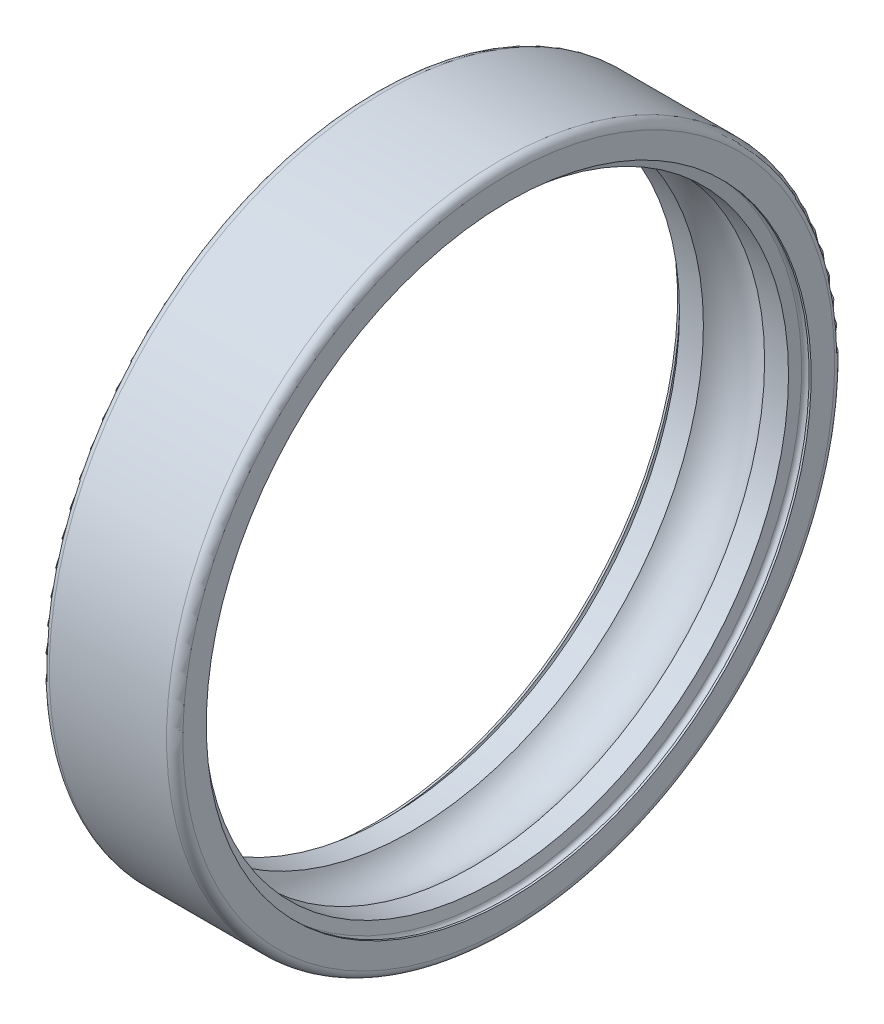
ISO-10303-21;
HEADER;
FILE_DESCRIPTION(('STEP AP214'),'2;1');
FILE_NAME('part.step','',(''),(''),'','','');
FILE_SCHEMA(('AUTOMOTIVE_DESIGN { 1 0 10303 214 1 1 1 1 }'));
ENDSEC;
DATA;
#1=APPLICATION_CONTEXT('core data for automotive mechanical design processes');
#2=APPLICATION_PROTOCOL_DEFINITION('international standard','automotive_design',2000,#1);
#3=PRODUCT_CONTEXT('',#1,'mechanical');
#4=PRODUCT('Part','Part','',(#3));
#5=PRODUCT_RELATED_PRODUCT_CATEGORY('part','',(#4));
#6=PRODUCT_DEFINITION_FORMATION('','',#4);
#7=PRODUCT_DEFINITION_CONTEXT('part definition',#1,'design');
#8=PRODUCT_DEFINITION('design','',#6,#7);
#9=PRODUCT_DEFINITION_SHAPE('','',#8);
#10=(LENGTH_UNIT() NAMED_UNIT(*) SI_UNIT(.MILLI.,.METRE.));
#11=(NAMED_UNIT(*) PLANE_ANGLE_UNIT() SI_UNIT($,.RADIAN.));
#12=(NAMED_UNIT(*) SI_UNIT($,.STERADIAN.) SOLID_ANGLE_UNIT());
#13=UNCERTAINTY_MEASURE_WITH_UNIT(LENGTH_MEASURE(1.E-05),#10,'distance_accuracy_value','');
#14=(GEOMETRIC_REPRESENTATION_CONTEXT(3) GLOBAL_UNCERTAINTY_ASSIGNED_CONTEXT((#13)) GLOBAL_UNIT_ASSIGNED_CONTEXT((#10,
#11,#12)) REPRESENTATION_CONTEXT('',''));
#15=CARTESIAN_POINT('',(0.,0.,0.));
#16=DIRECTION('',(0.,0.,1.));
#17=DIRECTION('',(1.,0.,0.));
#18=AXIS2_PLACEMENT_3D('',#15,#16,#17);
#19=CARTESIAN_POINT('',(17.16,0.,0.));
#20=DIRECTION('',(1.,0.,0.));
#21=DIRECTION('',(0.,0.,-1.));
#22=AXIS2_PLACEMENT_3D('',#19,#20,#21);
#23=TOROIDAL_SURFACE('',#22,40.75,0.56);
#24=CARTESIAN_POINT('',(17.72,0.,0.));
#25=DIRECTION('',(1.,0.,0.));
#26=DIRECTION('',(0.,1.,0.));
#27=AXIS2_PLACEMENT_3D('',#24,#25,#26);
#28=CIRCLE('',#27,40.75);
#29=CARTESIAN_POINT('',(17.72,40.75,0.));
#30=VERTEX_POINT('',#29);
#31=EDGE_CURVE('E11',#30,#30,#28,.T.);
#32=ORIENTED_EDGE('',*,*,#31,.T.);
#33=EDGE_LOOP('',(#32));
#34=FACE_BOUND('',#33,.T.);
#35=CARTESIAN_POINT('',(16.6085076583131,0.,0.));
#36=DIRECTION('',(1.,0.,0.));
#37=DIRECTION('',(0.,1.,0.));
#38=AXIS2_PLACEMENT_3D('',#35,#36,#37);
#39=CIRCLE('',#38,40.8472429794935);
#40=CARTESIAN_POINT('',(16.6085076583131,40.8472429794935,0.));
#41=VERTEX_POINT('',#40);
#42=EDGE_CURVE('E102',#41,#41,#39,.T.);
#43=ORIENTED_EDGE('',*,*,#42,.F.);
#44=EDGE_LOOP('',(#43));
#45=FACE_BOUND('',#44,.T.);
#46=ADVANCED_FACE('F16',(#34,#45),#23,.F.);
#47=CARTESIAN_POINT('',(17.86,0.,0.));
#48=DIRECTION('',(-1.,0.,0.));
#49=DIRECTION('',(0.,1.,0.));
#50=AXIS2_PLACEMENT_3D('',#47,#48,#49);
#51=CYLINDRICAL_SURFACE('',#50,40.75);
#52=CARTESIAN_POINT('',(18.,0.,0.));
#53=DIRECTION('',(1.,0.,0.));
#54=DIRECTION('',(0.,1.,0.));
#55=AXIS2_PLACEMENT_3D('',#52,#53,#54);
#56=CIRCLE('',#55,40.75);
#57=CARTESIAN_POINT('',(18.,40.75,0.));
#58=VERTEX_POINT('',#57);
#59=EDGE_CURVE('E25',#58,#58,#56,.T.);
#60=ORIENTED_EDGE('',*,*,#59,.T.);
#61=EDGE_LOOP('',(#60));
#62=FACE_BOUND('',#61,.T.);
#63=ORIENTED_EDGE('',*,*,#31,.F.);
#64=EDGE_LOOP('',(#63));
#65=FACE_BOUND('',#64,.T.);
#66=ADVANCED_FACE('F119',(#62,#65),#51,.F.);
#67=CARTESIAN_POINT('',(18.,42.325,0.));
#68=DIRECTION('',(1.,0.,0.));
#69=DIRECTION('',(0.,1.,0.));
#70=AXIS2_PLACEMENT_3D('',#67,#68,#69);
#71=PLANE('',#70);
#72=CARTESIAN_POINT('',(18.,0.,0.));
#73=DIRECTION('',(1.,0.,0.));
#74=DIRECTION('',(0.,1.,0.));
#75=AXIS2_PLACEMENT_3D('',#72,#73,#74);
#76=CIRCLE('',#75,43.9);
#77=CARTESIAN_POINT('',(18.,43.9,0.));
#78=VERTEX_POINT('',#77);
#79=EDGE_CURVE('E73',#78,#78,#76,.T.);
#80=ORIENTED_EDGE('',*,*,#79,.T.);
#81=EDGE_LOOP('',(#80));
#82=FACE_BOUND('',#81,.T.);
#83=ORIENTED_EDGE('',*,*,#59,.F.);
#84=EDGE_LOOP('',(#83));
#85=FACE_BOUND('',#84,.T.);
#86=ADVANCED_FACE('F124',(#82,#85),#71,.T.);
#87=CARTESIAN_POINT('',(16.9,0.,0.));
#88=DIRECTION('',(1.,0.,0.));
#89=DIRECTION('',(0.,0.,-1.));
#90=AXIS2_PLACEMENT_3D('',#87,#88,#89);
#91=TOROIDAL_SURFACE('',#90,43.9,1.1);
#92=CARTESIAN_POINT('',(16.9,0.,0.));
#93=DIRECTION('',(1.,0.,0.));
#94=DIRECTION('',(0.,1.,0.));
#95=AXIS2_PLACEMENT_3D('',#92,#93,#94);
#96=CIRCLE('',#95,45.);
#97=CARTESIAN_POINT('',(16.9,45.,0.));
#98=VERTEX_POINT('',#97);
#99=EDGE_CURVE('E20',#98,#98,#96,.T.);
#100=ORIENTED_EDGE('',*,*,#99,.T.);
#101=EDGE_LOOP('',(#100));
#102=FACE_BOUND('',#101,.T.);
#103=ORIENTED_EDGE('',*,*,#79,.F.);
#104=EDGE_LOOP('',(#103));
#105=FACE_BOUND('',#104,.T.);
#106=ADVANCED_FACE('F70',(#102,#105),#91,.T.);
#107=CARTESIAN_POINT('',(9.,0.,0.));
#108=DIRECTION('',(-1.,0.,0.));
#109=DIRECTION('',(0.,1.,0.));
#110=AXIS2_PLACEMENT_3D('',#107,#108,#109);
#111=CYLINDRICAL_SURFACE('',#110,45.);
#112=CARTESIAN_POINT('',(1.1,0.,0.));
#113=DIRECTION('',(1.,0.,0.));
#114=DIRECTION('',(0.,1.,0.));
#115=AXIS2_PLACEMENT_3D('',#112,#113,#114);
#116=CIRCLE('',#115,45.);
#117=CARTESIAN_POINT('',(1.1,45.,0.));
#118=VERTEX_POINT('',#117);
#119=EDGE_CURVE('E74',#118,#118,#116,.T.);
#120=ORIENTED_EDGE('',*,*,#119,.T.);
#121=EDGE_LOOP('',(#120));
#122=FACE_BOUND('',#121,.T.);
#123=ORIENTED_EDGE('',*,*,#99,.F.);
#124=EDGE_LOOP('',(#123));
#125=FACE_BOUND('',#124,.T.);
#126=ADVANCED_FACE('F146',(#122,#125),#111,.T.);
#127=CARTESIAN_POINT('',(1.1,0.,0.));
#128=DIRECTION('',(1.,0.,0.));
#129=DIRECTION('',(0.,0.,-1.));
#130=AXIS2_PLACEMENT_3D('',#127,#128,#129);
#131=TOROIDAL_SURFACE('',#130,43.9,1.1);
#132=CARTESIAN_POINT('',(0.,0.,0.));
#133=DIRECTION('',(1.,0.,0.));
#134=DIRECTION('',(0.,1.,0.));
#135=AXIS2_PLACEMENT_3D('',#132,#133,#134);
#136=CIRCLE('',#135,43.9);
#137=CARTESIAN_POINT('',(0.,43.9,0.));
#138=VERTEX_POINT('',#137);
#139=EDGE_CURVE('E76',#138,#138,#136,.T.);
#140=ORIENTED_EDGE('',*,*,#139,.T.);
#141=EDGE_LOOP('',(#140));
#142=FACE_BOUND('',#141,.T.);
#143=ORIENTED_EDGE('',*,*,#119,.F.);
#144=EDGE_LOOP('',(#143));
#145=FACE_BOUND('',#144,.T.);
#146=ADVANCED_FACE('F144',(#142,#145),#131,.T.);
#147=CARTESIAN_POINT('',(0.,42.325,0.));
#148=DIRECTION('',(-1.,0.,0.));
#149=DIRECTION('',(0.,-1.,0.));
#150=AXIS2_PLACEMENT_3D('',#147,#148,#149);
#151=PLANE('',#150);
#152=CARTESIAN_POINT('',(0.,0.,0.));
#153=DIRECTION('',(1.,0.,0.));
#154=DIRECTION('',(0.,1.,0.));
#155=AXIS2_PLACEMENT_3D('',#152,#153,#154);
#156=CIRCLE('',#155,40.75);
#157=CARTESIAN_POINT('',(0.,40.75,0.));
#158=VERTEX_POINT('',#157);
#159=EDGE_CURVE('E80',#158,#158,#156,.T.);
#160=ORIENTED_EDGE('',*,*,#159,.T.);
#161=EDGE_LOOP('',(#160));
#162=FACE_BOUND('',#161,.T.);
#163=ORIENTED_EDGE('',*,*,#139,.F.);
#164=EDGE_LOOP('',(#163));
#165=FACE_BOUND('',#164,.T.);
#166=ADVANCED_FACE('F134',(#162,#165),#151,.T.);
#167=CARTESIAN_POINT('',(0.14,0.,0.));
#168=DIRECTION('',(-1.,0.,0.));
#169=DIRECTION('',(0.,1.,0.));
#170=AXIS2_PLACEMENT_3D('',#167,#168,#169);
#171=CYLINDRICAL_SURFACE('',#170,40.75);
#172=CARTESIAN_POINT('',(0.28,0.,0.));
#173=DIRECTION('',(1.,0.,0.));
#174=DIRECTION('',(0.,1.,0.));
#175=AXIS2_PLACEMENT_3D('',#172,#173,#174);
#176=CIRCLE('',#175,40.75);
#177=CARTESIAN_POINT('',(0.28,40.75,0.));
#178=VERTEX_POINT('',#177);
#179=EDGE_CURVE('E85',#178,#178,#176,.T.);
#180=ORIENTED_EDGE('',*,*,#179,.T.);
#181=EDGE_LOOP('',(#180));
#182=FACE_BOUND('',#181,.T.);
#183=ORIENTED_EDGE('',*,*,#159,.F.);
#184=EDGE_LOOP('',(#183));
#185=FACE_BOUND('',#184,.T.);
#186=ADVANCED_FACE('F130',(#182,#185),#171,.F.);
#187=CARTESIAN_POINT('',(0.84,0.,0.));
#188=DIRECTION('',(1.,0.,0.));
#189=DIRECTION('',(0.,0.,-1.));
#190=AXIS2_PLACEMENT_3D('',#187,#188,#189);
#191=TOROIDAL_SURFACE('',#190,40.75,0.56);
#192=CARTESIAN_POINT('',(1.39149234168683,0.,0.));
#193=DIRECTION('',(1.,0.,0.));
#194=DIRECTION('',(0.,1.,0.));
#195=AXIS2_PLACEMENT_3D('',#192,#193,#194);
#196=CIRCLE('',#195,40.8472429794935);
#197=CARTESIAN_POINT('',(1.39149234168683,40.8472429794935,0.));
#198=VERTEX_POINT('',#197);
#199=EDGE_CURVE('E83',#198,#198,#196,.T.);
#200=ORIENTED_EDGE('',*,*,#199,.T.);
#201=EDGE_LOOP('',(#200));
#202=FACE_BOUND('',#201,.T.);
#203=ORIENTED_EDGE('',*,*,#179,.F.);
#204=EDGE_LOOP('',(#203));
#205=FACE_BOUND('',#204,.T.);
#206=ADVANCED_FACE('F133',(#202,#205),#191,.F.);
#207=CARTESIAN_POINT('',(1.52349450866735,0.,0.));
#208=DIRECTION('',(-1.,0.,0.));
#209=DIRECTION('',(0.,1.,0.));
#210=AXIS2_PLACEMENT_3D('',#207,#208,#209);
#211=CONICAL_SURFACE('',#210,40.0986214897467,1.39626340159546);
#212=CARTESIAN_POINT('',(1.65549667564787,0.,0.));
#213=DIRECTION('',(1.,0.,0.));
#214=DIRECTION('',(0.,1.,0.));
#215=AXIS2_PLACEMENT_3D('',#212,#213,#214);
#216=CIRCLE('',#215,39.35);
#217=CARTESIAN_POINT('',(1.65549667564787,39.35,0.));
#218=VERTEX_POINT('',#217);
#219=EDGE_CURVE('E90',#218,#218,#216,.T.);
#220=ORIENTED_EDGE('',*,*,#219,.T.);
#221=EDGE_LOOP('',(#220));
#222=FACE_BOUND('',#221,.T.);
#223=ORIENTED_EDGE('',*,*,#199,.F.);
#224=EDGE_LOOP('',(#223));
#225=FACE_BOUND('',#224,.T.);
#226=ADVANCED_FACE('F128',(#222,#225),#211,.F.);
#227=CARTESIAN_POINT('',(3.26556258903698,0.,0.));
#228=DIRECTION('',(-1.,0.,0.));
#229=DIRECTION('',(0.,1.,0.));
#230=AXIS2_PLACEMENT_3D('',#227,#228,#229);
#231=CYLINDRICAL_SURFACE('',#230,39.35);
#232=CARTESIAN_POINT('',(4.87562850242609,0.,0.));
#233=DIRECTION('',(1.,0.,0.));
#234=DIRECTION('',(0.,1.,0.));
#235=AXIS2_PLACEMENT_3D('',#232,#233,#234);
#236=CIRCLE('',#235,39.35);
#237=CARTESIAN_POINT('',(4.87562850242609,39.35,0.));
#238=VERTEX_POINT('',#237);
#239=EDGE_CURVE('E93',#238,#238,#236,.T.);
#240=ORIENTED_EDGE('',*,*,#239,.T.);
#241=EDGE_LOOP('',(#240));
#242=FACE_BOUND('',#241,.T.);
#243=ORIENTED_EDGE('',*,*,#219,.F.);
#244=EDGE_LOOP('',(#243));
#245=FACE_BOUND('',#244,.T.);
#246=ADVANCED_FACE('F137',(#242,#245),#231,.F.);
#247=CARTESIAN_POINT('',(9.,0.,0.));
#248=DIRECTION('',(1.,0.,0.));
#249=DIRECTION('',(0.,0.,-1.));
#250=AXIS2_PLACEMENT_3D('',#247,#248,#249);
#251=TOROIDAL_SURFACE('',#250,36.25,5.1595);
#252=CARTESIAN_POINT('',(13.1243714975739,0.,0.));
#253=DIRECTION('',(1.,0.,0.));
#254=DIRECTION('',(0.,1.,0.));
#255=AXIS2_PLACEMENT_3D('',#252,#253,#254);
#256=CIRCLE('',#255,39.35);
#257=CARTESIAN_POINT('',(13.1243714975739,39.35,0.));
#258=VERTEX_POINT('',#257);
#259=EDGE_CURVE('E97',#258,#258,#256,.T.);
#260=ORIENTED_EDGE('',*,*,#259,.T.);
#261=EDGE_LOOP('',(#260));
#262=FACE_BOUND('',#261,.T.);
#263=ORIENTED_EDGE('',*,*,#239,.F.);
#264=EDGE_LOOP('',(#263));
#265=FACE_BOUND('',#264,.T.);
#266=ADVANCED_FACE('F116',(#262,#265),#251,.F.);
#267=CARTESIAN_POINT('',(14.734437410963,0.,0.));
#268=DIRECTION('',(-1.,0.,0.));
#269=DIRECTION('',(0.,1.,0.));
#270=AXIS2_PLACEMENT_3D('',#267,#268,#269);
#271=CYLINDRICAL_SURFACE('',#270,39.35);
#272=CARTESIAN_POINT('',(16.3445033243522,0.,0.));
#273=DIRECTION('',(1.,0.,0.));
#274=DIRECTION('',(0.,1.,0.));
#275=AXIS2_PLACEMENT_3D('',#272,#273,#274);
#276=CIRCLE('',#275,39.35);
#277=CARTESIAN_POINT('',(16.3445033243522,39.35,0.));
#278=VERTEX_POINT('',#277);
#279=EDGE_CURVE('E103',#278,#278,#276,.T.);
#280=ORIENTED_EDGE('',*,*,#279,.T.);
#281=EDGE_LOOP('',(#280));
#282=FACE_BOUND('',#281,.T.);
#283=ORIENTED_EDGE('',*,*,#259,.F.);
#284=EDGE_LOOP('',(#283));
#285=FACE_BOUND('',#284,.T.);
#286=ADVANCED_FACE('F108',(#282,#285),#271,.F.);
#287=CARTESIAN_POINT('',(16.4765054913327,0.,0.));
#288=DIRECTION('',(1.,0.,0.));
#289=DIRECTION('',(0.,1.,0.));
#290=AXIS2_PLACEMENT_3D('',#287,#288,#289);
#291=CONICAL_SURFACE('',#290,40.0986214897467,1.39626340159546);
#292=ORIENTED_EDGE('',*,*,#42,.T.);
#293=EDGE_LOOP('',(#292));
#294=FACE_BOUND('',#293,.T.);
#295=ORIENTED_EDGE('',*,*,#279,.F.);
#296=EDGE_LOOP('',(#295));
#297=FACE_BOUND('',#296,.T.);
#298=ADVANCED_FACE('F18',(#294,#297),#291,.F.);
#299=CLOSED_SHELL('',(#46,#66,#86,#106,#126,#146,#166,#186,#206,#226,#246,#266,#286,#298));
#300=MANIFOLD_SOLID_BREP('B1',#299);
#301=ADVANCED_BREP_SHAPE_REPRESENTATION('',(#18,#300),#14);
#302=SHAPE_DEFINITION_REPRESENTATION(#9,#301);
ENDSEC;
END-ISO-10303-21;
